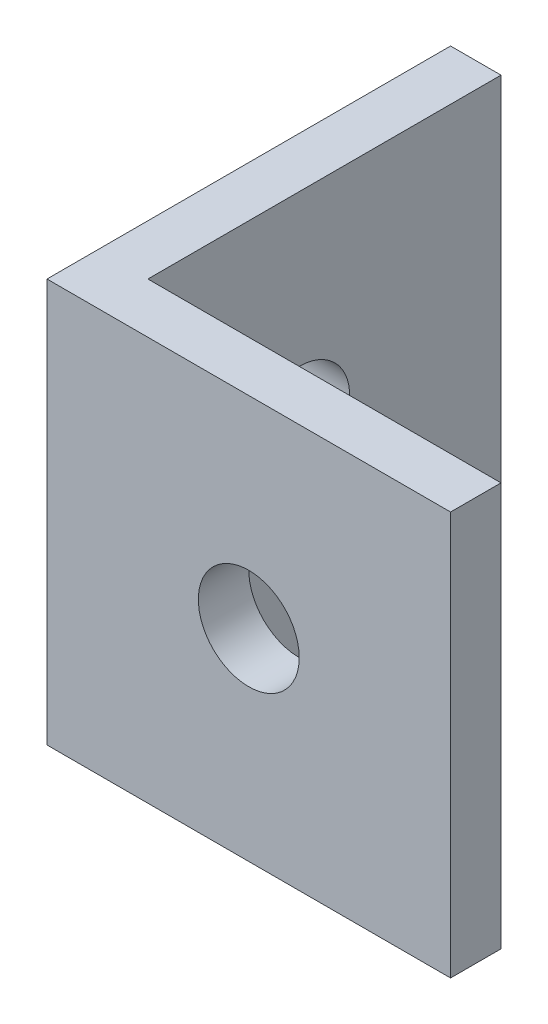
ISO-10303-21;
HEADER;
FILE_DESCRIPTION(('STEP AP214'),'2;1');
FILE_NAME('part.step','',(''),(''),'','','');
FILE_SCHEMA(('AUTOMOTIVE_DESIGN { 1 0 10303 214 1 1 1 1 }'));
ENDSEC;
DATA;
#1=APPLICATION_CONTEXT('core data for automotive mechanical design processes');
#2=APPLICATION_PROTOCOL_DEFINITION('international standard','automotive_design',2000,#1);
#3=PRODUCT_CONTEXT('',#1,'mechanical');
#4=PRODUCT('Part','Part','',(#3));
#5=PRODUCT_RELATED_PRODUCT_CATEGORY('part','',(#4));
#6=PRODUCT_DEFINITION_FORMATION('','',#4);
#7=PRODUCT_DEFINITION_CONTEXT('part definition',#1,'design');
#8=PRODUCT_DEFINITION('design','',#6,#7);
#9=PRODUCT_DEFINITION_SHAPE('','',#8);
#10=(LENGTH_UNIT() NAMED_UNIT(*) SI_UNIT(.MILLI.,.METRE.));
#11=(NAMED_UNIT(*) PLANE_ANGLE_UNIT() SI_UNIT($,.RADIAN.));
#12=(NAMED_UNIT(*) SI_UNIT($,.STERADIAN.) SOLID_ANGLE_UNIT());
#13=UNCERTAINTY_MEASURE_WITH_UNIT(LENGTH_MEASURE(1.E-05),#10,'distance_accuracy_value','');
#14=(GEOMETRIC_REPRESENTATION_CONTEXT(3) GLOBAL_UNCERTAINTY_ASSIGNED_CONTEXT((#13)) GLOBAL_UNIT_ASSIGNED_CONTEXT((#10,
#11,#12)) REPRESENTATION_CONTEXT('',''));
#15=CARTESIAN_POINT('',(0.,0.,0.));
#16=DIRECTION('',(0.,0.,1.));
#17=DIRECTION('',(1.,0.,0.));
#18=AXIS2_PLACEMENT_3D('',#15,#16,#17);
#19=CARTESIAN_POINT('',(0.,25.4,-25.4));
#20=DIRECTION('',(1.,0.,0.));
#21=DIRECTION('',(0.,0.,-1.));
#22=AXIS2_PLACEMENT_3D('',#19,#20,#21);
#23=PLANE('',#22);
#24=CARTESIAN_POINT('',(0.,12.7,-12.7));
#25=DIRECTION('',(-1.,0.,0.));
#26=DIRECTION('',(0.,0.,1.));
#27=AXIS2_PLACEMENT_3D('',#24,#25,#26);
#28=CIRCLE('',#27,3.175);
#29=CARTESIAN_POINT('',(0.,12.7,-9.525));
#30=VERTEX_POINT('',#29);
#31=EDGE_CURVE('E150',#30,#30,#28,.T.);
#32=ORIENTED_EDGE('',*,*,#31,.F.);
#33=EDGE_LOOP('',(#32));
#34=FACE_BOUND('',#33,.T.);
#35=DIRECTION('',(0.,0.,1.));
#36=VECTOR('',#35,1.);
#37=CARTESIAN_POINT('',(0.,0.,-25.4));
#38=LINE('',#37,#36);
#39=CARTESIAN_POINT('',(0.,0.,-25.4));
#40=VERTEX_POINT('',#39);
#41=CARTESIAN_POINT('',(0.,0.,0.));
#42=VERTEX_POINT('',#41);
#43=EDGE_CURVE('E125',#40,#42,#38,.T.);
#44=ORIENTED_EDGE('',*,*,#43,.T.);
#45=DIRECTION('',(0.,-1.,0.));
#46=VECTOR('',#45,1.);
#47=CARTESIAN_POINT('',(0.,25.4,0.));
#48=LINE('',#47,#46);
#49=CARTESIAN_POINT('',(0.,25.4,0.));
#50=VERTEX_POINT('',#49);
#51=EDGE_CURVE('E11',#50,#42,#48,.T.);
#52=ORIENTED_EDGE('',*,*,#51,.F.);
#53=DIRECTION('',(0.,0.,1.));
#54=VECTOR('',#53,1.);
#55=CARTESIAN_POINT('',(0.,25.4,-25.4));
#56=LINE('',#55,#54);
#57=CARTESIAN_POINT('',(0.,25.4,-25.4));
#58=VERTEX_POINT('',#57);
#59=EDGE_CURVE('E136',#58,#50,#56,.T.);
#60=ORIENTED_EDGE('',*,*,#59,.F.);
#61=DIRECTION('',(0.,-1.,0.));
#62=VECTOR('',#61,1.);
#63=CARTESIAN_POINT('',(0.,25.4,-25.4));
#64=LINE('',#63,#62);
#65=EDGE_CURVE('E121',#58,#40,#64,.T.);
#66=ORIENTED_EDGE('',*,*,#65,.T.);
#67=EDGE_LOOP('',(#44,#52,#60,#66));
#68=FACE_BOUND('',#67,.T.);
#69=ADVANCED_FACE('F39',(#34,#68),#23,.F.);
#70=CARTESIAN_POINT('',(0.,25.4,0.));
#71=DIRECTION('',(0.,0.,-1.));
#72=DIRECTION('',(-1.,0.,0.));
#73=AXIS2_PLACEMENT_3D('',#70,#71,#72);
#74=PLANE('',#73);
#75=CARTESIAN_POINT('',(12.7,12.7,0.));
#76=DIRECTION('',(0.,0.,1.));
#77=DIRECTION('',(1.,0.,0.));
#78=AXIS2_PLACEMENT_3D('',#75,#76,#77);
#79=CIRCLE('',#78,3.175);
#80=CARTESIAN_POINT('',(15.875,12.7,0.));
#81=VERTEX_POINT('',#80);
#82=EDGE_CURVE('E142',#81,#81,#79,.T.);
#83=ORIENTED_EDGE('',*,*,#82,.F.);
#84=EDGE_LOOP('',(#83));
#85=FACE_BOUND('',#84,.T.);
#86=DIRECTION('',(1.,0.,0.));
#87=VECTOR('',#86,1.);
#88=CARTESIAN_POINT('',(0.,0.,0.));
#89=LINE('',#88,#87);
#90=CARTESIAN_POINT('',(25.4,0.,0.));
#91=VERTEX_POINT('',#90);
#92=EDGE_CURVE('E128',#42,#91,#89,.T.);
#93=ORIENTED_EDGE('',*,*,#92,.T.);
#94=DIRECTION('',(0.,-1.,0.));
#95=VECTOR('',#94,1.);
#96=CARTESIAN_POINT('',(25.4,25.4,0.));
#97=LINE('',#96,#95);
#98=CARTESIAN_POINT('',(25.4,25.4,0.));
#99=VERTEX_POINT('',#98);
#100=EDGE_CURVE('E48',#99,#91,#97,.T.);
#101=ORIENTED_EDGE('',*,*,#100,.F.);
#102=DIRECTION('',(1.,0.,0.));
#103=VECTOR('',#102,1.);
#104=CARTESIAN_POINT('',(0.,25.4,0.));
#105=LINE('',#104,#103);
#106=EDGE_CURVE('E94',#50,#99,#105,.T.);
#107=ORIENTED_EDGE('',*,*,#106,.F.);
#108=ORIENTED_EDGE('',*,*,#51,.T.);
#109=EDGE_LOOP('',(#93,#101,#107,#108));
#110=FACE_BOUND('',#109,.T.);
#111=ADVANCED_FACE('F156',(#85,#110),#74,.F.);
#112=CARTESIAN_POINT('',(25.4,25.4,0.));
#113=DIRECTION('',(-1.,0.,0.));
#114=DIRECTION('',(0.,0.,1.));
#115=AXIS2_PLACEMENT_3D('',#112,#113,#114);
#116=PLANE('',#115);
#117=DIRECTION('',(0.,0.,-1.));
#118=VECTOR('',#117,1.);
#119=CARTESIAN_POINT('',(25.4,0.,0.));
#120=LINE('',#119,#118);
#121=CARTESIAN_POINT('',(25.4,0.,-3.175));
#122=VERTEX_POINT('',#121);
#123=EDGE_CURVE('E131',#91,#122,#120,.T.);
#124=ORIENTED_EDGE('',*,*,#123,.T.);
#125=DIRECTION('',(0.,-1.,0.));
#126=VECTOR('',#125,1.);
#127=CARTESIAN_POINT('',(25.4,25.4,-3.175));
#128=LINE('',#127,#126);
#129=CARTESIAN_POINT('',(25.4,25.4,-3.175));
#130=VERTEX_POINT('',#129);
#131=EDGE_CURVE('E116',#130,#122,#128,.T.);
#132=ORIENTED_EDGE('',*,*,#131,.F.);
#133=DIRECTION('',(0.,0.,-1.));
#134=VECTOR('',#133,1.);
#135=CARTESIAN_POINT('',(25.4,25.4,0.));
#136=LINE('',#135,#134);
#137=EDGE_CURVE('E107',#99,#130,#136,.T.);
#138=ORIENTED_EDGE('',*,*,#137,.F.);
#139=ORIENTED_EDGE('',*,*,#100,.T.);
#140=EDGE_LOOP('',(#124,#132,#138,#139));
#141=FACE_BOUND('',#140,.T.);
#142=ADVANCED_FACE('F159',(#141),#116,.F.);
#143=CARTESIAN_POINT('',(25.4,25.4,-3.175));
#144=DIRECTION('',(0.,0.,1.));
#145=DIRECTION('',(1.,0.,0.));
#146=AXIS2_PLACEMENT_3D('',#143,#144,#145);
#147=PLANE('',#146);
#148=CARTESIAN_POINT('',(12.7,12.7,-3.175));
#149=DIRECTION('',(0.,0.,1.));
#150=DIRECTION('',(1.,0.,0.));
#151=AXIS2_PLACEMENT_3D('',#148,#149,#150);
#152=CIRCLE('',#151,3.175);
#153=CARTESIAN_POINT('',(15.875,12.7,-3.175));
#154=VERTEX_POINT('',#153);
#155=EDGE_CURVE('E129',#154,#154,#152,.T.);
#156=ORIENTED_EDGE('',*,*,#155,.T.);
#157=EDGE_LOOP('',(#156));
#158=FACE_BOUND('',#157,.T.);
#159=DIRECTION('',(-1.,0.,0.));
#160=VECTOR('',#159,1.);
#161=CARTESIAN_POINT('',(25.4,0.,-3.175));
#162=LINE('',#161,#160);
#163=CARTESIAN_POINT('',(3.175,0.,-3.175));
#164=VERTEX_POINT('',#163);
#165=EDGE_CURVE('E115',#122,#164,#162,.T.);
#166=ORIENTED_EDGE('',*,*,#165,.T.);
#167=DIRECTION('',(0.,-1.,0.));
#168=VECTOR('',#167,1.);
#169=CARTESIAN_POINT('',(3.175,25.4,-3.175));
#170=LINE('',#169,#168);
#171=CARTESIAN_POINT('',(3.175,25.4,-3.175));
#172=VERTEX_POINT('',#171);
#173=EDGE_CURVE('E112',#172,#164,#170,.T.);
#174=ORIENTED_EDGE('',*,*,#173,.F.);
#175=DIRECTION('',(-1.,0.,0.));
#176=VECTOR('',#175,1.);
#177=CARTESIAN_POINT('',(25.4,25.4,-3.175));
#178=LINE('',#177,#176);
#179=EDGE_CURVE('E101',#130,#172,#178,.T.);
#180=ORIENTED_EDGE('',*,*,#179,.F.);
#181=ORIENTED_EDGE('',*,*,#131,.T.);
#182=EDGE_LOOP('',(#166,#174,#180,#181));
#183=FACE_BOUND('',#182,.T.);
#184=ADVANCED_FACE('F113',(#158,#183),#147,.F.);
#185=CARTESIAN_POINT('',(3.175,25.4,-3.175));
#186=DIRECTION('',(-1.,0.,0.));
#187=DIRECTION('',(0.,0.,1.));
#188=AXIS2_PLACEMENT_3D('',#185,#186,#187);
#189=PLANE('',#188);
#190=CARTESIAN_POINT('',(3.175,12.7,-12.7));
#191=DIRECTION('',(-1.,0.,0.));
#192=DIRECTION('',(0.,0.,1.));
#193=AXIS2_PLACEMENT_3D('',#190,#191,#192);
#194=CIRCLE('',#193,3.175);
#195=CARTESIAN_POINT('',(3.175,12.7,-9.525));
#196=VERTEX_POINT('',#195);
#197=EDGE_CURVE('E42',#196,#196,#194,.T.);
#198=ORIENTED_EDGE('',*,*,#197,.T.);
#199=EDGE_LOOP('',(#198));
#200=FACE_BOUND('',#199,.T.);
#201=DIRECTION('',(0.,0.,-1.));
#202=VECTOR('',#201,1.);
#203=CARTESIAN_POINT('',(3.175,0.,-3.175));
#204=LINE('',#203,#202);
#205=CARTESIAN_POINT('',(3.175,0.,-25.4));
#206=VERTEX_POINT('',#205);
#207=EDGE_CURVE('E80',#164,#206,#204,.T.);
#208=ORIENTED_EDGE('',*,*,#207,.T.);
#209=DIRECTION('',(0.,-1.,0.));
#210=VECTOR('',#209,1.);
#211=CARTESIAN_POINT('',(3.175,25.4,-25.4));
#212=LINE('',#211,#210);
#213=CARTESIAN_POINT('',(3.175,25.4,-25.4));
#214=VERTEX_POINT('',#213);
#215=EDGE_CURVE('E117',#214,#206,#212,.T.);
#216=ORIENTED_EDGE('',*,*,#215,.F.);
#217=DIRECTION('',(0.,0.,-1.));
#218=VECTOR('',#217,1.);
#219=CARTESIAN_POINT('',(3.175,25.4,-3.175));
#220=LINE('',#219,#218);
#221=EDGE_CURVE('E105',#172,#214,#220,.T.);
#222=ORIENTED_EDGE('',*,*,#221,.F.);
#223=ORIENTED_EDGE('',*,*,#173,.T.);
#224=EDGE_LOOP('',(#208,#216,#222,#223));
#225=FACE_BOUND('',#224,.T.);
#226=ADVANCED_FACE('F119',(#200,#225),#189,.F.);
#227=CARTESIAN_POINT('',(3.175,25.4,-25.4));
#228=DIRECTION('',(0.,0.,1.));
#229=DIRECTION('',(1.,0.,0.));
#230=AXIS2_PLACEMENT_3D('',#227,#228,#229);
#231=PLANE('',#230);
#232=DIRECTION('',(-1.,0.,0.));
#233=VECTOR('',#232,1.);
#234=CARTESIAN_POINT('',(3.175,0.,-25.4));
#235=LINE('',#234,#233);
#236=EDGE_CURVE('E86',#206,#40,#235,.T.);
#237=ORIENTED_EDGE('',*,*,#236,.T.);
#238=ORIENTED_EDGE('',*,*,#65,.F.);
#239=DIRECTION('',(-1.,0.,0.));
#240=VECTOR('',#239,1.);
#241=CARTESIAN_POINT('',(3.175,25.4,-25.4));
#242=LINE('',#241,#240);
#243=EDGE_CURVE('E57',#214,#58,#242,.T.);
#244=ORIENTED_EDGE('',*,*,#243,.F.);
#245=ORIENTED_EDGE('',*,*,#215,.T.);
#246=EDGE_LOOP('',(#237,#238,#244,#245));
#247=FACE_BOUND('',#246,.T.);
#248=ADVANCED_FACE('F164',(#247),#231,.F.);
#249=CARTESIAN_POINT('',(0.,25.4,0.));
#250=DIRECTION('',(0.,1.,0.));
#251=DIRECTION('',(0.,0.,1.));
#252=AXIS2_PLACEMENT_3D('',#249,#250,#251);
#253=PLANE('',#252);
#254=ORIENTED_EDGE('',*,*,#59,.T.);
#255=ORIENTED_EDGE('',*,*,#106,.T.);
#256=ORIENTED_EDGE('',*,*,#137,.T.);
#257=ORIENTED_EDGE('',*,*,#179,.T.);
#258=ORIENTED_EDGE('',*,*,#221,.T.);
#259=ORIENTED_EDGE('',*,*,#243,.T.);
#260=EDGE_LOOP('',(#254,#255,#256,#257,#258,#259));
#261=FACE_BOUND('',#260,.T.);
#262=ADVANCED_FACE('F103',(#261),#253,.T.);
#263=CARTESIAN_POINT('',(0.,0.,0.));
#264=DIRECTION('',(0.,1.,0.));
#265=DIRECTION('',(0.,0.,1.));
#266=AXIS2_PLACEMENT_3D('',#263,#264,#265);
#267=PLANE('',#266);
#268=ORIENTED_EDGE('',*,*,#43,.F.);
#269=ORIENTED_EDGE('',*,*,#236,.F.);
#270=ORIENTED_EDGE('',*,*,#207,.F.);
#271=ORIENTED_EDGE('',*,*,#165,.F.);
#272=ORIENTED_EDGE('',*,*,#123,.F.);
#273=ORIENTED_EDGE('',*,*,#92,.F.);
#274=EDGE_LOOP('',(#268,#269,#270,#271,#272,#273));
#275=FACE_BOUND('',#274,.T.);
#276=ADVANCED_FACE('F162',(#275),#267,.F.);
#277=CARTESIAN_POINT('',(12.7,12.7,-25.4));
#278=DIRECTION('',(0.,0.,1.));
#279=DIRECTION('',(1.,0.,0.));
#280=AXIS2_PLACEMENT_3D('',#277,#278,#279);
#281=CYLINDRICAL_SURFACE('',#280,3.175);
#282=ORIENTED_EDGE('',*,*,#82,.T.);
#283=EDGE_LOOP('',(#282));
#284=FACE_BOUND('',#283,.T.);
#285=ORIENTED_EDGE('',*,*,#155,.F.);
#286=EDGE_LOOP('',(#285));
#287=FACE_BOUND('',#286,.T.);
#288=ADVANCED_FACE('F189',(#284,#287),#281,.F.);
#289=CARTESIAN_POINT('',(25.4,12.7,-12.7));
#290=DIRECTION('',(-1.,0.,0.));
#291=DIRECTION('',(0.,0.,1.));
#292=AXIS2_PLACEMENT_3D('',#289,#290,#291);
#293=CYLINDRICAL_SURFACE('',#292,3.175);
#294=ORIENTED_EDGE('',*,*,#31,.T.);
#295=EDGE_LOOP('',(#294));
#296=FACE_BOUND('',#295,.T.);
#297=ORIENTED_EDGE('',*,*,#197,.F.);
#298=EDGE_LOOP('',(#297));
#299=FACE_BOUND('',#298,.T.);
#300=ADVANCED_FACE('F186',(#296,#299),#293,.F.);
#301=CLOSED_SHELL('',(#69,#111,#142,#184,#226,#248,#262,#276,#288,#300));
#302=MANIFOLD_SOLID_BREP('B2',#301);
#303=ADVANCED_BREP_SHAPE_REPRESENTATION('',(#18,#302),#14);
#304=SHAPE_DEFINITION_REPRESENTATION(#9,#303);
ENDSEC;
END-ISO-10303-21;
